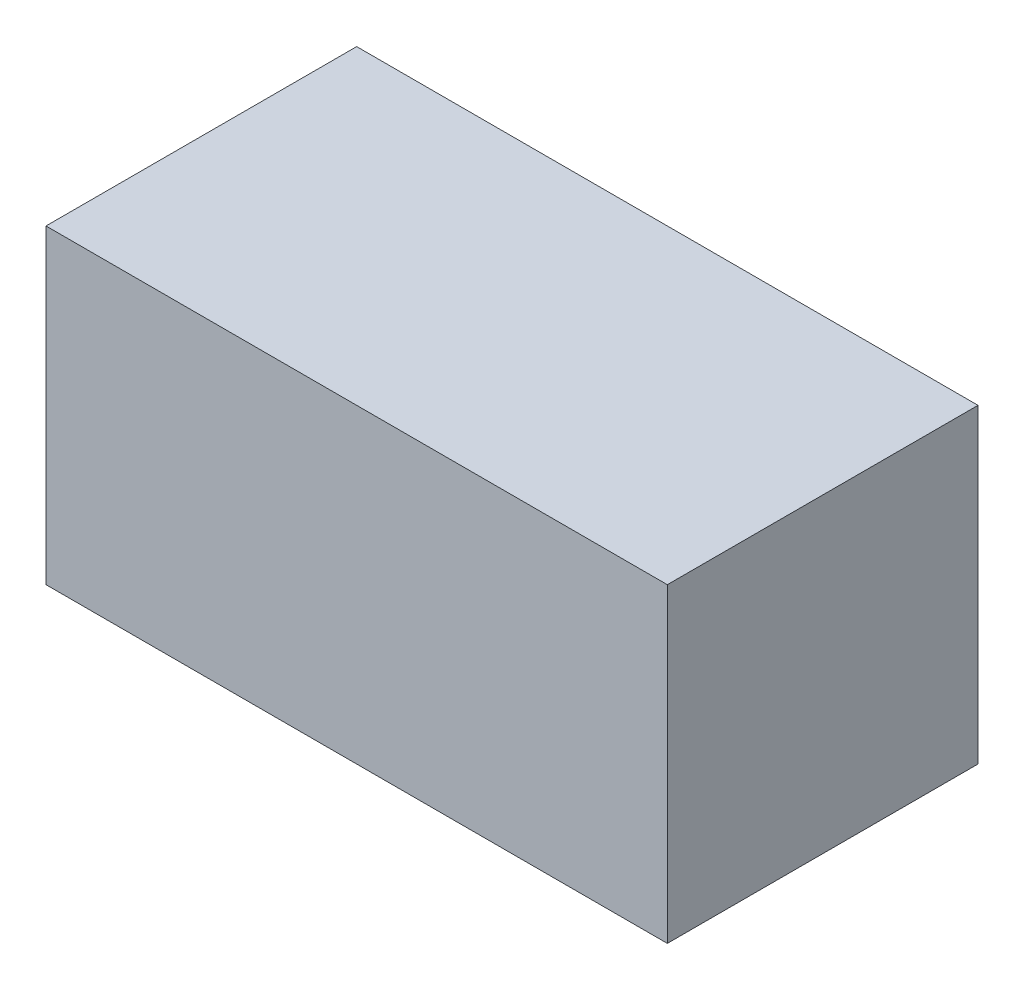
ISO-10303-21;
HEADER;
FILE_DESCRIPTION(('STEP AP214'),'2;1');
FILE_NAME('part.step','',(''),(''),'','','');
FILE_SCHEMA(('AUTOMOTIVE_DESIGN { 1 0 10303 214 1 1 1 1 }'));
ENDSEC;
DATA;
#1=APPLICATION_CONTEXT('core data for automotive mechanical design processes');
#2=APPLICATION_PROTOCOL_DEFINITION('international standard','automotive_design',2000,#1);
#3=PRODUCT_CONTEXT('',#1,'mechanical');
#4=PRODUCT('Part','Part','',(#3));
#5=PRODUCT_RELATED_PRODUCT_CATEGORY('part','',(#4));
#6=PRODUCT_DEFINITION_FORMATION('','',#4);
#7=PRODUCT_DEFINITION_CONTEXT('part definition',#1,'design');
#8=PRODUCT_DEFINITION('design','',#6,#7);
#9=PRODUCT_DEFINITION_SHAPE('','',#8);
#10=(LENGTH_UNIT() NAMED_UNIT(*) SI_UNIT(.MILLI.,.METRE.));
#11=(NAMED_UNIT(*) PLANE_ANGLE_UNIT() SI_UNIT($,.RADIAN.));
#12=(NAMED_UNIT(*) SI_UNIT($,.STERADIAN.) SOLID_ANGLE_UNIT());
#13=UNCERTAINTY_MEASURE_WITH_UNIT(LENGTH_MEASURE(1.E-05),#10,'distance_accuracy_value','');
#14=(GEOMETRIC_REPRESENTATION_CONTEXT(3) GLOBAL_UNCERTAINTY_ASSIGNED_CONTEXT((#13)) GLOBAL_UNIT_ASSIGNED_CONTEXT((#10,
#11,#12)) REPRESENTATION_CONTEXT('',''));
#15=CARTESIAN_POINT('',(0.,0.,0.));
#16=DIRECTION('',(0.,0.,1.));
#17=DIRECTION('',(1.,0.,0.));
#18=AXIS2_PLACEMENT_3D('',#15,#16,#17);
#19=CARTESIAN_POINT('',(19.99996,19.99996,9.99998));
#20=DIRECTION('',(-1.,0.,0.));
#21=DIRECTION('',(0.,0.,1.));
#22=AXIS2_PLACEMENT_3D('',#19,#20,#21);
#23=PLANE('',#22);
#24=DIRECTION('',(0.,0.,-1.));
#25=VECTOR('',#24,1.);
#26=CARTESIAN_POINT('',(19.99996,0.,9.99998));
#27=LINE('',#26,#25);
#28=CARTESIAN_POINT('',(19.99996,0.,9.99998));
#29=VERTEX_POINT('',#28);
#30=CARTESIAN_POINT('',(19.99996,0.,-9.99998));
#31=VERTEX_POINT('',#30);
#32=EDGE_CURVE('E95',#29,#31,#27,.T.);
#33=ORIENTED_EDGE('',*,*,#32,.T.);
#34=DIRECTION('',(0.,-1.,0.));
#35=VECTOR('',#34,1.);
#36=CARTESIAN_POINT('',(19.99996,19.99996,-9.99998));
#37=LINE('',#36,#35);
#38=CARTESIAN_POINT('',(19.99996,19.99996,-9.99998));
#39=VERTEX_POINT('',#38);
#40=EDGE_CURVE('E11',#39,#31,#37,.T.);
#41=ORIENTED_EDGE('',*,*,#40,.F.);
#42=DIRECTION('',(0.,0.,-1.));
#43=VECTOR('',#42,1.);
#44=CARTESIAN_POINT('',(19.99996,19.99996,9.99998));
#45=LINE('',#44,#43);
#46=CARTESIAN_POINT('',(19.99996,19.99996,9.99998));
#47=VERTEX_POINT('',#46);
#48=EDGE_CURVE('E83',#47,#39,#45,.T.);
#49=ORIENTED_EDGE('',*,*,#48,.F.);
#50=DIRECTION('',(0.,-1.,0.));
#51=VECTOR('',#50,1.);
#52=CARTESIAN_POINT('',(19.99996,19.99996,9.99998));
#53=LINE('',#52,#51);
#54=EDGE_CURVE('E91',#47,#29,#53,.T.);
#55=ORIENTED_EDGE('',*,*,#54,.T.);
#56=EDGE_LOOP('',(#33,#41,#49,#55));
#57=FACE_BOUND('',#56,.T.);
#58=ADVANCED_FACE('F32',(#57),#23,.F.);
#59=CARTESIAN_POINT('',(-19.99996,19.99996,-9.99998));
#60=DIRECTION('',(0.,0.,1.));
#61=DIRECTION('',(1.,0.,0.));
#62=AXIS2_PLACEMENT_3D('',#59,#60,#61);
#63=PLANE('',#62);
#64=DIRECTION('',(-1.,0.,0.));
#65=VECTOR('',#64,1.);
#66=CARTESIAN_POINT('',(-19.99996,0.,-9.99998));
#67=LINE('',#66,#65);
#68=CARTESIAN_POINT('',(-19.99996,0.,-9.99998));
#69=VERTEX_POINT('',#68);
#70=EDGE_CURVE('E87',#31,#69,#67,.T.);
#71=ORIENTED_EDGE('',*,*,#70,.T.);
#72=DIRECTION('',(0.,-1.,0.));
#73=VECTOR('',#72,1.);
#74=CARTESIAN_POINT('',(-19.99996,19.99996,-9.99998));
#75=LINE('',#74,#73);
#76=CARTESIAN_POINT('',(-19.99996,19.99996,-9.99998));
#77=VERTEX_POINT('',#76);
#78=EDGE_CURVE('E40',#77,#69,#75,.T.);
#79=ORIENTED_EDGE('',*,*,#78,.F.);
#80=DIRECTION('',(-1.,0.,0.));
#81=VECTOR('',#80,1.);
#82=CARTESIAN_POINT('',(-19.99996,19.99996,-9.99998));
#83=LINE('',#82,#81);
#84=EDGE_CURVE('E78',#39,#77,#83,.T.);
#85=ORIENTED_EDGE('',*,*,#84,.F.);
#86=ORIENTED_EDGE('',*,*,#40,.T.);
#87=EDGE_LOOP('',(#71,#79,#85,#86));
#88=FACE_BOUND('',#87,.T.);
#89=ADVANCED_FACE('F86',(#88),#63,.F.);
#90=CARTESIAN_POINT('',(-19.99996,19.99996,9.99998));
#91=DIRECTION('',(1.,0.,0.));
#92=DIRECTION('',(0.,0.,-1.));
#93=AXIS2_PLACEMENT_3D('',#90,#91,#92);
#94=PLANE('',#93);
#95=DIRECTION('',(0.,0.,1.));
#96=VECTOR('',#95,1.);
#97=CARTESIAN_POINT('',(-19.99996,0.,9.99998));
#98=LINE('',#97,#96);
#99=CARTESIAN_POINT('',(-19.99996,0.,9.99998));
#100=VERTEX_POINT('',#99);
#101=EDGE_CURVE('E65',#69,#100,#98,.T.);
#102=ORIENTED_EDGE('',*,*,#101,.T.);
#103=DIRECTION('',(0.,-1.,0.));
#104=VECTOR('',#103,1.);
#105=CARTESIAN_POINT('',(-19.99996,19.99996,9.99998));
#106=LINE('',#105,#104);
#107=CARTESIAN_POINT('',(-19.99996,19.99996,9.99998));
#108=VERTEX_POINT('',#107);
#109=EDGE_CURVE('E88',#108,#100,#106,.T.);
#110=ORIENTED_EDGE('',*,*,#109,.F.);
#111=DIRECTION('',(0.,0.,1.));
#112=VECTOR('',#111,1.);
#113=CARTESIAN_POINT('',(-19.99996,19.99996,9.99998));
#114=LINE('',#113,#112);
#115=EDGE_CURVE('E81',#77,#108,#114,.T.);
#116=ORIENTED_EDGE('',*,*,#115,.F.);
#117=ORIENTED_EDGE('',*,*,#78,.T.);
#118=EDGE_LOOP('',(#102,#110,#116,#117));
#119=FACE_BOUND('',#118,.T.);
#120=ADVANCED_FACE('F89',(#119),#94,.F.);
#121=CARTESIAN_POINT('',(-19.99996,19.99996,9.99998));
#122=DIRECTION('',(0.,0.,-1.));
#123=DIRECTION('',(-1.,0.,0.));
#124=AXIS2_PLACEMENT_3D('',#121,#122,#123);
#125=PLANE('',#124);
#126=DIRECTION('',(1.,0.,0.));
#127=VECTOR('',#126,1.);
#128=CARTESIAN_POINT('',(-19.99996,0.,9.99998));
#129=LINE('',#128,#127);
#130=EDGE_CURVE('E71',#100,#29,#129,.T.);
#131=ORIENTED_EDGE('',*,*,#130,.T.);
#132=ORIENTED_EDGE('',*,*,#54,.F.);
#133=DIRECTION('',(1.,0.,0.));
#134=VECTOR('',#133,1.);
#135=CARTESIAN_POINT('',(-19.99996,19.99996,9.99998));
#136=LINE('',#135,#134);
#137=EDGE_CURVE('E48',#108,#47,#136,.T.);
#138=ORIENTED_EDGE('',*,*,#137,.F.);
#139=ORIENTED_EDGE('',*,*,#109,.T.);
#140=EDGE_LOOP('',(#131,#132,#138,#139));
#141=FACE_BOUND('',#140,.T.);
#142=ADVANCED_FACE('F102',(#141),#125,.F.);
#143=CARTESIAN_POINT('',(0.,19.99996,0.));
#144=DIRECTION('',(0.,-1.,0.));
#145=DIRECTION('',(0.,0.,-1.));
#146=AXIS2_PLACEMENT_3D('',#143,#144,#145);
#147=PLANE('',#146);
#148=ORIENTED_EDGE('',*,*,#48,.T.);
#149=ORIENTED_EDGE('',*,*,#84,.T.);
#150=ORIENTED_EDGE('',*,*,#115,.T.);
#151=ORIENTED_EDGE('',*,*,#137,.T.);
#152=EDGE_LOOP('',(#148,#149,#150,#151));
#153=FACE_BOUND('',#152,.T.);
#154=ADVANCED_FACE('F79',(#153),#147,.F.);
#155=CARTESIAN_POINT('',(0.,0.,0.));
#156=DIRECTION('',(0.,-1.,0.));
#157=DIRECTION('',(0.,0.,-1.));
#158=AXIS2_PLACEMENT_3D('',#155,#156,#157);
#159=PLANE('',#158);
#160=ORIENTED_EDGE('',*,*,#32,.F.);
#161=ORIENTED_EDGE('',*,*,#130,.F.);
#162=ORIENTED_EDGE('',*,*,#101,.F.);
#163=ORIENTED_EDGE('',*,*,#70,.F.);
#164=EDGE_LOOP('',(#160,#161,#162,#163));
#165=FACE_BOUND('',#164,.T.);
#166=ADVANCED_FACE('F105',(#165),#159,.T.);
#167=CLOSED_SHELL('',(#58,#89,#120,#142,#154,#166));
#168=MANIFOLD_SOLID_BREP('B2',#167);
#169=ADVANCED_BREP_SHAPE_REPRESENTATION('',(#18,#168),#14);
#170=SHAPE_DEFINITION_REPRESENTATION(#9,#169);
ENDSEC;
END-ISO-10303-21;
